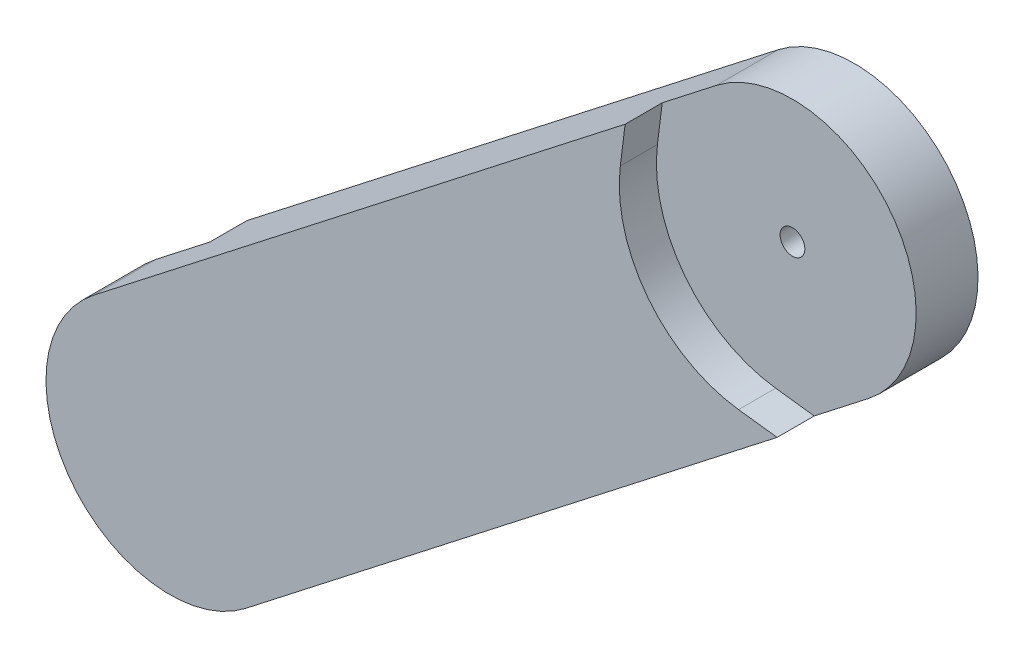
ISO-10303-21;
HEADER;
FILE_DESCRIPTION(('STEP AP214'),'2;1');
FILE_NAME('part.step','',(''),(''),'','','');
FILE_SCHEMA(('AUTOMOTIVE_DESIGN { 1 0 10303 214 1 1 1 1 }'));
ENDSEC;
DATA;
#1=APPLICATION_CONTEXT('core data for automotive mechanical design processes');
#2=APPLICATION_PROTOCOL_DEFINITION('international standard','automotive_design',2000,#1);
#3=PRODUCT_CONTEXT('',#1,'mechanical');
#4=PRODUCT('Part','Part','',(#3));
#5=PRODUCT_RELATED_PRODUCT_CATEGORY('part','',(#4));
#6=PRODUCT_DEFINITION_FORMATION('','',#4);
#7=PRODUCT_DEFINITION_CONTEXT('part definition',#1,'design');
#8=PRODUCT_DEFINITION('design','',#6,#7);
#9=PRODUCT_DEFINITION_SHAPE('','',#8);
#10=(LENGTH_UNIT() NAMED_UNIT(*) SI_UNIT(.MILLI.,.METRE.));
#11=(NAMED_UNIT(*) PLANE_ANGLE_UNIT() SI_UNIT($,.RADIAN.));
#12=(NAMED_UNIT(*) SI_UNIT($,.STERADIAN.) SOLID_ANGLE_UNIT());
#13=UNCERTAINTY_MEASURE_WITH_UNIT(LENGTH_MEASURE(1.E-05),#10,'distance_accuracy_value','');
#14=(GEOMETRIC_REPRESENTATION_CONTEXT(3) GLOBAL_UNCERTAINTY_ASSIGNED_CONTEXT((#13)) GLOBAL_UNIT_ASSIGNED_CONTEXT((#10,
#11,#12)) REPRESENTATION_CONTEXT('',''));
#15=CARTESIAN_POINT('',(0.,0.,0.));
#16=DIRECTION('',(0.,0.,1.));
#17=DIRECTION('',(1.,0.,0.));
#18=AXIS2_PLACEMENT_3D('',#15,#16,#17);
#19=CARTESIAN_POINT('',(15.3589378147156,-19.7256946443896,20.));
#20=DIRECTION('',(-0.614357512588623,0.789027785775583,0.));
#21=DIRECTION('',(-0.789027785775583,-0.614357512588623,0.));
#22=AXIS2_PLACEMENT_3D('',#19,#20,#21);
#23=PLANE('',#22);
#24=DIRECTION('',(0.,0.,-1.));
#25=VECTOR('',#24,1.);
#26=CARTESIAN_POINT('',(122.752820942784,63.8939700812821,20.000012));
#27=LINE('',#26,#25);
#28=CARTESIAN_POINT('',(122.752820942784,63.8939700812821,20.));
#29=VERTEX_POINT('',#28);
#30=CARTESIAN_POINT('',(122.752820942784,63.8939700812821,12.5));
#31=VERTEX_POINT('',#30);
#32=EDGE_CURVE('E181',#29,#31,#27,.T.);
#33=ORIENTED_EDGE('',*,*,#32,.F.);
#34=DIRECTION('',(0.789027785775583,0.614357512588623,0.));
#35=VECTOR('',#34,1.);
#36=CARTESIAN_POINT('',(15.3589378147156,-19.7256946443896,20.));
#37=LINE('',#36,#35);
#38=CARTESIAN_POINT('',(15.3589378147156,-19.7256946443896,20.));
#39=VERTEX_POINT('',#38);
#40=EDGE_CURVE('E130',#39,#29,#37,.T.);
#41=ORIENTED_EDGE('',*,*,#40,.F.);
#42=DIRECTION('',(0.,0.,-1.));
#43=VECTOR('',#42,1.);
#44=CARTESIAN_POINT('',(15.3589378147156,-19.7256946443896,20.));
#45=LINE('',#44,#43);
#46=CARTESIAN_POINT('',(15.3589378147156,-19.7256946443896,7.5));
#47=VERTEX_POINT('',#46);
#48=EDGE_CURVE('E106',#39,#47,#45,.T.);
#49=ORIENTED_EDGE('',*,*,#48,.T.);
#50=DIRECTION('',(-0.789027785775583,-0.614357512588623,0.));
#51=VECTOR('',#50,1.);
#52=CARTESIAN_POINT('',(15.3589378147156,-19.7256946443896,7.5));
#53=LINE('',#52,#51);
#54=CARTESIAN_POINT('',(26.3192225529846,-11.1917324817679,7.5));
#55=VERTEX_POINT('',#54);
#56=EDGE_CURVE('E172',#55,#47,#53,.T.);
#57=ORIENTED_EDGE('',*,*,#56,.F.);
#58=DIRECTION('',(0.,0.,-1.));
#59=VECTOR('',#58,1.);
#60=CARTESIAN_POINT('',(26.3192225529846,-11.1917324817679,7.5));
#61=LINE('',#60,#59);
#62=CARTESIAN_POINT('',(26.3192225529846,-11.1917324817679,0.));
#63=VERTEX_POINT('',#62);
#64=EDGE_CURVE('E148',#55,#63,#61,.T.);
#65=ORIENTED_EDGE('',*,*,#64,.T.);
#66=DIRECTION('',(0.789027785775583,0.614357512588623,0.));
#67=VECTOR('',#66,1.);
#68=CARTESIAN_POINT('',(15.3589378147156,-19.7256946443896,0.));
#69=LINE('',#68,#67);
#70=CARTESIAN_POINT('',(133.713105681053,72.4279322439039,0.));
#71=VERTEX_POINT('',#70);
#72=EDGE_CURVE('E126',#63,#71,#69,.T.);
#73=ORIENTED_EDGE('',*,*,#72,.T.);
#74=DIRECTION('',(0.,0.,-1.));
#75=VECTOR('',#74,1.);
#76=CARTESIAN_POINT('',(133.713105681053,72.4279322439039,20.));
#77=LINE('',#76,#75);
#78=CARTESIAN_POINT('',(133.713105681053,72.4279322439039,12.5));
#79=VERTEX_POINT('',#78);
#80=EDGE_CURVE('E109',#79,#71,#77,.T.);
#81=ORIENTED_EDGE('',*,*,#80,.F.);
#82=DIRECTION('',(0.789027785775583,0.614357512588623,0.));
#83=VECTOR('',#82,1.);
#84=CARTESIAN_POINT('',(15.3589378147156,-19.7256946443896,12.5));
#85=LINE('',#84,#83);
#86=EDGE_CURVE('E101',#31,#79,#85,.T.);
#87=ORIENTED_EDGE('',*,*,#86,.F.);
#88=EDGE_LOOP('',(#33,#41,#49,#57,#65,#73,#81,#87));
#89=FACE_BOUND('',#88,.T.);
#90=ADVANCED_FACE('F41',(#89),#23,.F.);
#91=CARTESIAN_POINT('',(-15.3589378147156,19.7256946443896,20.));
#92=DIRECTION('',(0.614357512588623,-0.789027785775583,0.));
#93=DIRECTION('',(0.789027785775583,0.614357512588623,0.));
#94=AXIS2_PLACEMENT_3D('',#91,#92,#93);
#95=PLANE('',#94);
#96=DIRECTION('',(-0.789027785775583,-0.614357512588623,0.));
#97=VECTOR('',#96,1.);
#98=CARTESIAN_POINT('',(-15.3589378147156,19.7256946443896,20.));
#99=LINE('',#98,#97);
#100=CARTESIAN_POINT('',(92.0349453133528,103.345359370061,20.));
#101=VERTEX_POINT('',#100);
#102=CARTESIAN_POINT('',(-15.3589378147156,19.7256946443896,20.));
#103=VERTEX_POINT('',#102);
#104=EDGE_CURVE('E58',#101,#103,#99,.T.);
#105=ORIENTED_EDGE('',*,*,#104,.F.);
#106=DIRECTION('',(0.,0.,-1.));
#107=VECTOR('',#106,1.);
#108=CARTESIAN_POINT('',(92.0349453133528,103.345359370061,20.000012));
#109=LINE('',#108,#107);
#110=CARTESIAN_POINT('',(92.0349453133528,103.345359370061,12.5));
#111=VERTEX_POINT('',#110);
#112=EDGE_CURVE('E93',#101,#111,#109,.T.);
#113=ORIENTED_EDGE('',*,*,#112,.T.);
#114=DIRECTION('',(-0.789027785775583,-0.614357512588623,0.));
#115=VECTOR('',#114,1.);
#116=CARTESIAN_POINT('',(-15.3589378147156,19.7256946443896,12.5));
#117=LINE('',#116,#115);
#118=CARTESIAN_POINT('',(102.995230051622,111.879321532683,12.5));
#119=VERTEX_POINT('',#118);
#120=EDGE_CURVE('E193',#119,#111,#117,.T.);
#121=ORIENTED_EDGE('',*,*,#120,.F.);
#122=DIRECTION('',(0.,0.,-1.));
#123=VECTOR('',#122,1.);
#124=CARTESIAN_POINT('',(102.995230051622,111.879321532683,20.));
#125=LINE('',#124,#123);
#126=CARTESIAN_POINT('',(102.995230051622,111.879321532683,0.));
#127=VERTEX_POINT('',#126);
#128=EDGE_CURVE('E114',#119,#127,#125,.T.);
#129=ORIENTED_EDGE('',*,*,#128,.T.);
#130=DIRECTION('',(-0.789027785775583,-0.614357512588623,0.));
#131=VECTOR('',#130,1.);
#132=CARTESIAN_POINT('',(-15.3589378147156,19.7256946443896,0.));
#133=LINE('',#132,#131);
#134=CARTESIAN_POINT('',(-4.39865307644644,28.2596568070114,0.));
#135=VERTEX_POINT('',#134);
#136=EDGE_CURVE('E119',#127,#135,#133,.T.);
#137=ORIENTED_EDGE('',*,*,#136,.T.);
#138=DIRECTION('',(0.,0.,-1.));
#139=VECTOR('',#138,1.);
#140=CARTESIAN_POINT('',(-4.39865307644644,28.2596568070114,7.5));
#141=LINE('',#140,#139);
#142=CARTESIAN_POINT('',(-4.39865307644644,28.2596568070114,7.5));
#143=VERTEX_POINT('',#142);
#144=EDGE_CURVE('E152',#143,#135,#141,.T.);
#145=ORIENTED_EDGE('',*,*,#144,.F.);
#146=DIRECTION('',(0.789027785775583,0.614357512588623,0.));
#147=VECTOR('',#146,1.);
#148=CARTESIAN_POINT('',(-15.3589378147156,19.7256946443896,7.5));
#149=LINE('',#148,#147);
#150=CARTESIAN_POINT('',(-15.3589378147156,19.7256946443896,7.5));
#151=VERTEX_POINT('',#150);
#152=EDGE_CURVE('E169',#151,#143,#149,.T.);
#153=ORIENTED_EDGE('',*,*,#152,.F.);
#154=DIRECTION('',(0.,0.,-1.));
#155=VECTOR('',#154,1.);
#156=CARTESIAN_POINT('',(-15.3589378147156,19.7256946443896,20.));
#157=LINE('',#156,#155);
#158=EDGE_CURVE('E116',#103,#151,#157,.T.);
#159=ORIENTED_EDGE('',*,*,#158,.F.);
#160=EDGE_LOOP('',(#105,#113,#121,#129,#137,#145,#153,#159));
#161=FACE_BOUND('',#160,.T.);
#162=ADVANCED_FACE('F229',(#161),#95,.F.);
#163=CARTESIAN_POINT('',(0.,0.,0.));
#164=DIRECTION('',(0.,0.,1.));
#165=DIRECTION('',(1.,0.,0.));
#166=AXIS2_PLACEMENT_3D('',#163,#164,#165);
#167=PLANE('',#166);
#168=CARTESIAN_POINT('',(118.354167866338,92.1536268882935,0.));
#169=DIRECTION('',(0.,0.,1.));
#170=DIRECTION('',(1.,0.,0.));
#171=AXIS2_PLACEMENT_3D('',#168,#169,#170);
#172=CIRCLE('',#171,2.5);
#173=CARTESIAN_POINT('',(120.854167866338,92.1536268882935,0.));
#174=VERTEX_POINT('',#173);
#175=EDGE_CURVE('E196',#174,#174,#172,.T.);
#176=ORIENTED_EDGE('',*,*,#175,.T.);
#177=EDGE_LOOP('',(#176));
#178=FACE_BOUND('',#177,.T.);
#179=DIRECTION('',(-0.992343261090836,0.123510534642209,0.));
#180=VECTOR('',#179,1.);
#181=CARTESIAN_POINT('',(3.39653970266075,27.289439679998,0.));
#182=LINE('',#181,#180);
#183=CARTESIAN_POINT('',(3.39653970266073,27.289439679998,0.));
#184=VERTEX_POINT('',#183);
#185=EDGE_CURVE('E157',#184,#135,#182,.T.);
#186=ORIENTED_EDGE('',*,*,#185,.T.);
#187=ORIENTED_EDGE('',*,*,#136,.F.);
#188=CARTESIAN_POINT('',(118.354167866338,92.1536268882935,0.));
#189=DIRECTION('',(0.,0.,1.));
#190=DIRECTION('',(1.,0.,0.));
#191=AXIS2_PLACEMENT_3D('',#188,#189,#190);
#192=CIRCLE('',#191,25.);
#193=EDGE_CURVE('E123',#71,#127,#192,.T.);
#194=ORIENTED_EDGE('',*,*,#193,.F.);
#195=ORIENTED_EDGE('',*,*,#72,.F.);
#196=DIRECTION('',(0.123510534642211,0.992343261090836,0.));
#197=VECTOR('',#196,1.);
#198=CARTESIAN_POINT('',(27.289439679998,-3.39653970266081,0.));
#199=LINE('',#198,#197);
#200=CARTESIAN_POINT('',(27.289439679998,-3.39653970266083,0.));
#201=VERTEX_POINT('',#200);
#202=EDGE_CURVE('E161',#63,#201,#199,.T.);
#203=ORIENTED_EDGE('',*,*,#202,.T.);
#204=CARTESIAN_POINT('',(0.,0.,0.));
#205=DIRECTION('',(0.,0.,-1.));
#206=DIRECTION('',(-1.,0.,0.));
#207=AXIS2_PLACEMENT_3D('',#204,#205,#206);
#208=CIRCLE('',#207,27.5);
#209=EDGE_CURVE('E164',#184,#201,#208,.T.);
#210=ORIENTED_EDGE('',*,*,#209,.F.);
#211=EDGE_LOOP('',(#186,#187,#194,#195,#203,#210));
#212=FACE_BOUND('',#211,.T.);
#213=ADVANCED_FACE('F203',(#178,#212),#167,.F.);
#214=CARTESIAN_POINT('',(118.354167866338,92.1536268882935,20.));
#215=DIRECTION('',(0.,0.,-1.));
#216=DIRECTION('',(-1.,0.,0.));
#217=AXIS2_PLACEMENT_3D('',#214,#215,#216);
#218=CYLINDRICAL_SURFACE('',#217,25.);
#219=CARTESIAN_POINT('',(118.354167866338,92.1536268882935,12.5));
#220=DIRECTION('',(0.,0.,1.));
#221=DIRECTION('',(1.,0.,0.));
#222=AXIS2_PLACEMENT_3D('',#219,#220,#221);
#223=CIRCLE('',#222,25.);
#224=EDGE_CURVE('E139',#79,#119,#223,.T.);
#225=ORIENTED_EDGE('',*,*,#224,.F.);
#226=ORIENTED_EDGE('',*,*,#80,.T.);
#227=ORIENTED_EDGE('',*,*,#193,.T.);
#228=ORIENTED_EDGE('',*,*,#128,.F.);
#229=EDGE_LOOP('',(#225,#226,#227,#228));
#230=FACE_BOUND('',#229,.T.);
#231=ADVANCED_FACE('F225',(#230),#218,.T.);
#232=CARTESIAN_POINT('',(0.,0.,20.));
#233=DIRECTION('',(0.,0.,-1.));
#234=DIRECTION('',(-1.,0.,0.));
#235=AXIS2_PLACEMENT_3D('',#232,#233,#234);
#236=CYLINDRICAL_SURFACE('',#235,25.);
#237=CARTESIAN_POINT('',(0.,0.,7.5));
#238=DIRECTION('',(0.,0.,-1.));
#239=DIRECTION('',(-1.,0.,0.));
#240=AXIS2_PLACEMENT_3D('',#237,#238,#239);
#241=CIRCLE('',#240,25.);
#242=EDGE_CURVE('E128',#47,#151,#241,.T.);
#243=ORIENTED_EDGE('',*,*,#242,.F.);
#244=ORIENTED_EDGE('',*,*,#48,.F.);
#245=CARTESIAN_POINT('',(0.,0.,20.));
#246=DIRECTION('',(0.,0.,1.));
#247=DIRECTION('',(1.,0.,0.));
#248=AXIS2_PLACEMENT_3D('',#245,#246,#247);
#249=CIRCLE('',#248,25.);
#250=EDGE_CURVE('E122',#103,#39,#249,.T.);
#251=ORIENTED_EDGE('',*,*,#250,.F.);
#252=ORIENTED_EDGE('',*,*,#158,.T.);
#253=EDGE_LOOP('',(#243,#244,#251,#252));
#254=FACE_BOUND('',#253,.T.);
#255=ADVANCED_FACE('F43',(#254),#236,.T.);
#256=CARTESIAN_POINT('',(0.,0.,20.));
#257=DIRECTION('',(0.,0.,1.));
#258=DIRECTION('',(1.,0.,0.));
#259=AXIS2_PLACEMENT_3D('',#256,#257,#258);
#260=PLANE('',#259);
#261=DIRECTION('',(-0.123510534642205,-0.992343261090837,0.));
#262=VECTOR('',#261,1.);
#263=CARTESIAN_POINT('',(77.9644576973177,-9.70373078636124,20.));
#264=LINE('',#263,#262);
#265=CARTESIAN_POINT('',(91.0647281863395,95.5501665909541,20.));
#266=VERTEX_POINT('',#265);
#267=EDGE_CURVE('E12',#101,#266,#264,.T.);
#268=ORIENTED_EDGE('',*,*,#267,.F.);
#269=ORIENTED_EDGE('',*,*,#104,.T.);
#270=ORIENTED_EDGE('',*,*,#250,.T.);
#271=ORIENTED_EDGE('',*,*,#40,.T.);
#272=DIRECTION('',(-0.992343261090836,0.123510534642208,0.));
#273=VECTOR('',#272,1.);
#274=CARTESIAN_POINT('',(9.70373078636149,77.9644576973176,20.));
#275=LINE('',#274,#273);
#276=CARTESIAN_POINT('',(114.957628163677,64.8641872082954,20.));
#277=VERTEX_POINT('',#276);
#278=EDGE_CURVE('E105',#29,#277,#275,.T.);
#279=ORIENTED_EDGE('',*,*,#278,.T.);
#280=CARTESIAN_POINT('',(118.354167866338,92.1536268882935,20.));
#281=DIRECTION('',(0.,0.,-1.));
#282=DIRECTION('',(-1.,0.,0.));
#283=AXIS2_PLACEMENT_3D('',#280,#281,#282);
#284=CIRCLE('',#283,27.5);
#285=EDGE_CURVE('E45',#277,#266,#284,.T.);
#286=ORIENTED_EDGE('',*,*,#285,.T.);
#287=EDGE_LOOP('',(#268,#269,#270,#271,#279,#286));
#288=FACE_BOUND('',#287,.T.);
#289=ADVANCED_FACE('F103',(#288),#260,.T.);
#290=CARTESIAN_POINT('',(0.,0.,7.5));
#291=DIRECTION('',(0.,0.,-1.));
#292=DIRECTION('',(-1.,0.,0.));
#293=AXIS2_PLACEMENT_3D('',#290,#291,#292);
#294=PLANE('',#293);
#295=CARTESIAN_POINT('',(0.,0.,7.5));
#296=DIRECTION('',(0.,0.,-1.));
#297=DIRECTION('',(-1.,0.,0.));
#298=AXIS2_PLACEMENT_3D('',#295,#296,#297);
#299=CIRCLE('',#298,2.5);
#300=CARTESIAN_POINT('',(-2.5,0.,7.5));
#301=VERTEX_POINT('',#300);
#302=EDGE_CURVE('E136',#301,#301,#299,.T.);
#303=ORIENTED_EDGE('',*,*,#302,.F.);
#304=EDGE_LOOP('',(#303));
#305=FACE_BOUND('',#304,.T.);
#306=ORIENTED_EDGE('',*,*,#242,.T.);
#307=ORIENTED_EDGE('',*,*,#152,.T.);
#308=DIRECTION('',(-0.992343261090836,0.123510534642209,0.));
#309=VECTOR('',#308,1.);
#310=CARTESIAN_POINT('',(3.39653970266075,27.289439679998,7.5));
#311=LINE('',#310,#309);
#312=CARTESIAN_POINT('',(3.39653970266073,27.289439679998,7.5));
#313=VERTEX_POINT('',#312);
#314=EDGE_CURVE('E149',#313,#143,#311,.T.);
#315=ORIENTED_EDGE('',*,*,#314,.F.);
#316=CARTESIAN_POINT('',(0.,0.,7.5));
#317=DIRECTION('',(0.,0.,-1.));
#318=DIRECTION('',(-1.,0.,0.));
#319=AXIS2_PLACEMENT_3D('',#316,#317,#318);
#320=CIRCLE('',#319,27.5);
#321=CARTESIAN_POINT('',(27.289439679998,-3.39653970266083,7.5));
#322=VERTEX_POINT('',#321);
#323=EDGE_CURVE('E160',#313,#322,#320,.T.);
#324=ORIENTED_EDGE('',*,*,#323,.T.);
#325=DIRECTION('',(0.123510534642211,0.992343261090836,0.));
#326=VECTOR('',#325,1.);
#327=CARTESIAN_POINT('',(27.289439679998,-3.39653970266081,7.5));
#328=LINE('',#327,#326);
#329=EDGE_CURVE('E175',#55,#322,#328,.T.);
#330=ORIENTED_EDGE('',*,*,#329,.F.);
#331=ORIENTED_EDGE('',*,*,#56,.T.);
#332=EDGE_LOOP('',(#306,#307,#315,#324,#330,#331));
#333=FACE_BOUND('',#332,.T.);
#334=ADVANCED_FACE('F267',(#305,#333),#294,.T.);
#335=CARTESIAN_POINT('',(0.,0.,12.5));
#336=DIRECTION('',(0.,0.,-1.));
#337=DIRECTION('',(-1.,0.,0.));
#338=AXIS2_PLACEMENT_3D('',#335,#336,#337);
#339=CYLINDRICAL_SURFACE('',#338,2.5);
#340=CARTESIAN_POINT('',(0.,0.,12.5));
#341=DIRECTION('',(0.,0.,-1.));
#342=DIRECTION('',(-1.,0.,0.));
#343=AXIS2_PLACEMENT_3D('',#340,#341,#342);
#344=CIRCLE('',#343,2.5);
#345=CARTESIAN_POINT('',(-2.5,0.,12.5));
#346=VERTEX_POINT('',#345);
#347=EDGE_CURVE('E135',#346,#346,#344,.T.);
#348=ORIENTED_EDGE('',*,*,#347,.F.);
#349=EDGE_LOOP('',(#348));
#350=FACE_BOUND('',#349,.T.);
#351=ORIENTED_EDGE('',*,*,#302,.T.);
#352=EDGE_LOOP('',(#351));
#353=FACE_BOUND('',#352,.T.);
#354=ADVANCED_FACE('F294',(#350,#353),#339,.F.);
#355=CARTESIAN_POINT('',(0.,0.,12.5));
#356=DIRECTION('',(0.,0.,-1.));
#357=DIRECTION('',(-1.,0.,0.));
#358=AXIS2_PLACEMENT_3D('',#355,#356,#357);
#359=PLANE('',#358);
#360=ORIENTED_EDGE('',*,*,#347,.T.);
#361=EDGE_LOOP('',(#360));
#362=FACE_BOUND('',#361,.T.);
#363=ADVANCED_FACE('F217',(#362),#359,.T.);
#364=CARTESIAN_POINT('',(118.354167866338,92.1536268882935,12.5));
#365=DIRECTION('',(0.,0.,1.));
#366=DIRECTION('',(1.,0.,0.));
#367=AXIS2_PLACEMENT_3D('',#364,#365,#366);
#368=PLANE('',#367);
#369=CARTESIAN_POINT('',(118.354167866338,92.1536268882935,12.5));
#370=DIRECTION('',(0.,0.,1.));
#371=DIRECTION('',(1.,0.,0.));
#372=AXIS2_PLACEMENT_3D('',#369,#370,#371);
#373=CIRCLE('',#372,2.5);
#374=CARTESIAN_POINT('',(120.854167866338,92.1536268882935,12.5));
#375=VERTEX_POINT('',#374);
#376=EDGE_CURVE('E197',#375,#375,#373,.T.);
#377=ORIENTED_EDGE('',*,*,#376,.F.);
#378=EDGE_LOOP('',(#377));
#379=FACE_BOUND('',#378,.T.);
#380=ORIENTED_EDGE('',*,*,#224,.T.);
#381=ORIENTED_EDGE('',*,*,#120,.T.);
#382=DIRECTION('',(0.123510534642205,0.992343261090837,0.));
#383=VECTOR('',#382,1.);
#384=CARTESIAN_POINT('',(77.9644576973177,-9.70373078636124,12.5));
#385=LINE('',#384,#383);
#386=CARTESIAN_POINT('',(91.0647281863395,95.5501665909541,12.5));
#387=VERTEX_POINT('',#386);
#388=EDGE_CURVE('E191',#387,#111,#385,.T.);
#389=ORIENTED_EDGE('',*,*,#388,.F.);
#390=CARTESIAN_POINT('',(118.354167866338,92.1536268882935,12.5));
#391=DIRECTION('',(0.,0.,1.));
#392=DIRECTION('',(1.,0.,0.));
#393=AXIS2_PLACEMENT_3D('',#390,#391,#392);
#394=CIRCLE('',#393,27.5);
#395=CARTESIAN_POINT('',(114.957628163677,64.8641872082954,12.5));
#396=VERTEX_POINT('',#395);
#397=EDGE_CURVE('E100',#387,#396,#394,.T.);
#398=ORIENTED_EDGE('',*,*,#397,.T.);
#399=DIRECTION('',(0.992343261090836,-0.123510534642208,0.));
#400=VECTOR('',#399,1.);
#401=CARTESIAN_POINT('',(9.7037307863615,77.9644576973176,12.5));
#402=LINE('',#401,#400);
#403=EDGE_CURVE('E187',#396,#31,#402,.T.);
#404=ORIENTED_EDGE('',*,*,#403,.T.);
#405=ORIENTED_EDGE('',*,*,#86,.T.);
#406=EDGE_LOOP('',(#380,#381,#389,#398,#404,#405));
#407=FACE_BOUND('',#406,.T.);
#408=ADVANCED_FACE('F213',(#379,#407),#368,.T.);
#409=CARTESIAN_POINT('',(0.,0.,7.5));
#410=DIRECTION('',(0.,0.,-1.));
#411=DIRECTION('',(-1.,0.,0.));
#412=AXIS2_PLACEMENT_3D('',#409,#410,#411);
#413=CYLINDRICAL_SURFACE('',#412,27.5);
#414=ORIENTED_EDGE('',*,*,#209,.T.);
#415=DIRECTION('',(0.,0.,-1.));
#416=VECTOR('',#415,1.);
#417=CARTESIAN_POINT('',(27.289439679998,-3.39653970266083,7.5));
#418=LINE('',#417,#416);
#419=EDGE_CURVE('E145',#322,#201,#418,.T.);
#420=ORIENTED_EDGE('',*,*,#419,.F.);
#421=ORIENTED_EDGE('',*,*,#323,.F.);
#422=DIRECTION('',(0.,0.,-1.));
#423=VECTOR('',#422,1.);
#424=CARTESIAN_POINT('',(3.39653970266073,27.289439679998,7.5));
#425=LINE('',#424,#423);
#426=EDGE_CURVE('E144',#313,#184,#425,.T.);
#427=ORIENTED_EDGE('',*,*,#426,.T.);
#428=EDGE_LOOP('',(#414,#420,#421,#427));
#429=FACE_BOUND('',#428,.T.);
#430=ADVANCED_FACE('F216',(#429),#413,.F.);
#431=CARTESIAN_POINT('',(3.39653970266075,27.289439679998,7.5));
#432=DIRECTION('',(-0.123510534642209,-0.992343261090836,0.));
#433=DIRECTION('',(0.992343261090836,-0.123510534642209,0.));
#434=AXIS2_PLACEMENT_3D('',#431,#432,#433);
#435=PLANE('',#434);
#436=ORIENTED_EDGE('',*,*,#185,.F.);
#437=ORIENTED_EDGE('',*,*,#426,.F.);
#438=ORIENTED_EDGE('',*,*,#314,.T.);
#439=ORIENTED_EDGE('',*,*,#144,.T.);
#440=EDGE_LOOP('',(#436,#437,#438,#439));
#441=FACE_BOUND('',#440,.T.);
#442=ADVANCED_FACE('F304',(#441),#435,.T.);
#443=CARTESIAN_POINT('',(27.289439679998,-3.39653970266081,7.5));
#444=DIRECTION('',(-0.992343261090836,0.123510534642211,0.));
#445=DIRECTION('',(-0.123510534642211,-0.992343261090836,0.));
#446=AXIS2_PLACEMENT_3D('',#443,#444,#445);
#447=PLANE('',#446);
#448=ORIENTED_EDGE('',*,*,#202,.F.);
#449=ORIENTED_EDGE('',*,*,#64,.F.);
#450=ORIENTED_EDGE('',*,*,#329,.T.);
#451=ORIENTED_EDGE('',*,*,#419,.T.);
#452=EDGE_LOOP('',(#448,#449,#450,#451));
#453=FACE_BOUND('',#452,.T.);
#454=ADVANCED_FACE('F306',(#453),#447,.T.);
#455=CARTESIAN_POINT('',(77.9644576973177,-9.70373078636124,20.000012));
#456=DIRECTION('',(-0.992343261090837,0.123510534642205,0.));
#457=DIRECTION('',(-0.123510534642205,-0.992343261090837,0.));
#458=AXIS2_PLACEMENT_3D('',#455,#456,#457);
#459=PLANE('',#458);
#460=ORIENTED_EDGE('',*,*,#267,.T.);
#461=DIRECTION('',(0.,0.,1.));
#462=VECTOR('',#461,1.);
#463=CARTESIAN_POINT('',(91.0647281863395,95.5501665909541,12.5));
#464=LINE('',#463,#462);
#465=EDGE_CURVE('E89',#387,#266,#464,.T.);
#466=ORIENTED_EDGE('',*,*,#465,.F.);
#467=ORIENTED_EDGE('',*,*,#388,.T.);
#468=ORIENTED_EDGE('',*,*,#112,.F.);
#469=EDGE_LOOP('',(#460,#466,#467,#468));
#470=FACE_BOUND('',#469,.T.);
#471=ADVANCED_FACE('F86',(#470),#459,.F.);
#472=CARTESIAN_POINT('',(118.354167866338,92.1536268882935,20.000012));
#473=DIRECTION('',(0.,0.,-1.));
#474=DIRECTION('',(-1.,0.,0.));
#475=AXIS2_PLACEMENT_3D('',#472,#473,#474);
#476=CYLINDRICAL_SURFACE('',#475,27.5);
#477=DIRECTION('',(0.,0.,1.));
#478=VECTOR('',#477,1.);
#479=CARTESIAN_POINT('',(114.957628163677,64.8641872082954,12.5));
#480=LINE('',#479,#478);
#481=EDGE_CURVE('E77',#396,#277,#480,.T.);
#482=ORIENTED_EDGE('',*,*,#481,.F.);
#483=ORIENTED_EDGE('',*,*,#397,.F.);
#484=ORIENTED_EDGE('',*,*,#465,.T.);
#485=ORIENTED_EDGE('',*,*,#285,.F.);
#486=EDGE_LOOP('',(#482,#483,#484,#485));
#487=FACE_BOUND('',#486,.T.);
#488=ADVANCED_FACE('F97',(#487),#476,.F.);
#489=CARTESIAN_POINT('',(9.7037307863615,77.9644576973176,20.000012));
#490=DIRECTION('',(0.123510534642208,0.992343261090836,0.));
#491=DIRECTION('',(-0.992343261090836,0.123510534642208,0.));
#492=AXIS2_PLACEMENT_3D('',#489,#490,#491);
#493=PLANE('',#492);
#494=ORIENTED_EDGE('',*,*,#32,.T.);
#495=ORIENTED_EDGE('',*,*,#403,.F.);
#496=ORIENTED_EDGE('',*,*,#481,.T.);
#497=ORIENTED_EDGE('',*,*,#278,.F.);
#498=EDGE_LOOP('',(#494,#495,#496,#497));
#499=FACE_BOUND('',#498,.T.);
#500=ADVANCED_FACE('F209',(#499),#493,.T.);
#501=CARTESIAN_POINT('',(118.354167866338,92.1536268882935,0.));
#502=DIRECTION('',(0.,0.,1.));
#503=DIRECTION('',(1.,0.,0.));
#504=AXIS2_PLACEMENT_3D('',#501,#502,#503);
#505=CYLINDRICAL_SURFACE('',#504,2.5);
#506=ORIENTED_EDGE('',*,*,#175,.F.);
#507=EDGE_LOOP('',(#506));
#508=FACE_BOUND('',#507,.T.);
#509=ORIENTED_EDGE('',*,*,#376,.T.);
#510=EDGE_LOOP('',(#509));
#511=FACE_BOUND('',#510,.T.);
#512=ADVANCED_FACE('F206',(#508,#511),#505,.F.);
#513=CLOSED_SHELL('',(#90,#162,#213,#231,#255,#289,#334,#354,#363,#408,#430,#442,#454,#471,#488,
#500,#512));
#514=MANIFOLD_SOLID_BREP('B2',#513);
#515=ADVANCED_BREP_SHAPE_REPRESENTATION('',(#18,#514),#14);
#516=SHAPE_DEFINITION_REPRESENTATION(#9,#515);
ENDSEC;
END-ISO-10303-21;
